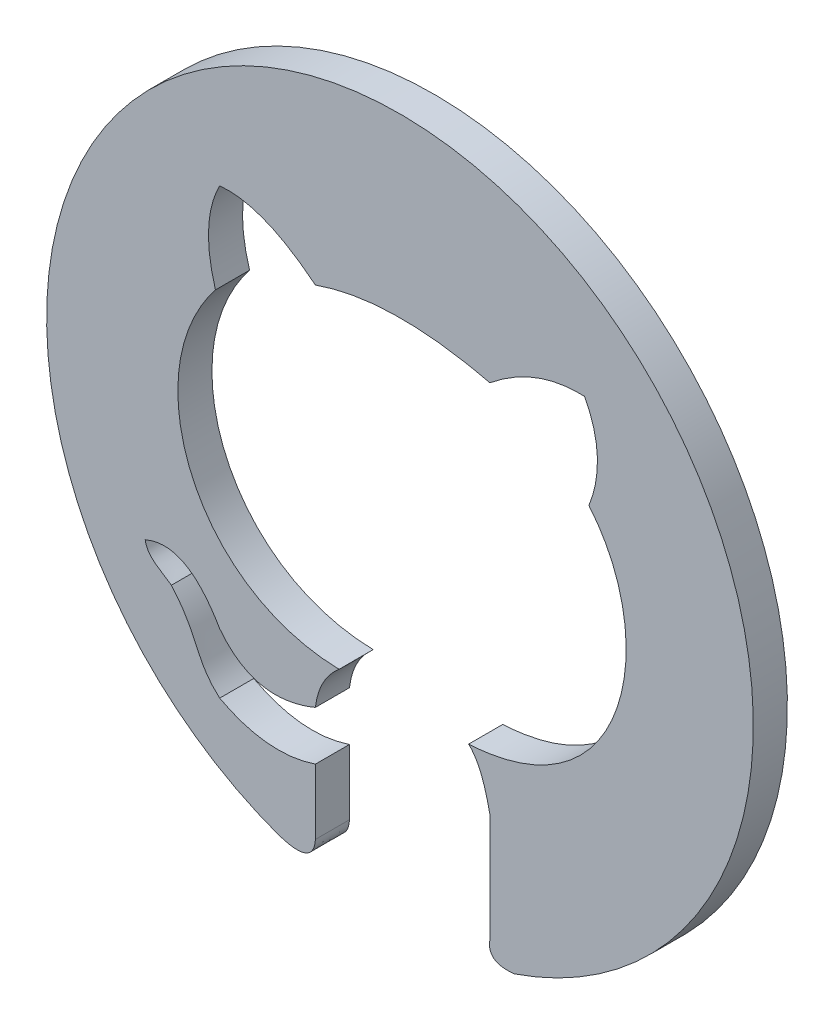
ISO-10303-21;
HEADER;
FILE_DESCRIPTION(('STEP AP214'),'2;1');
FILE_NAME('part.step','',(''),(''),'','','');
FILE_SCHEMA(('AUTOMOTIVE_DESIGN { 1 0 10303 214 1 1 1 1 }'));
ENDSEC;
DATA;
#1=APPLICATION_CONTEXT('core data for automotive mechanical design processes');
#2=APPLICATION_PROTOCOL_DEFINITION('international standard','automotive_design',2000,#1);
#3=PRODUCT_CONTEXT('',#1,'mechanical');
#4=PRODUCT('Part','Part','',(#3));
#5=PRODUCT_RELATED_PRODUCT_CATEGORY('part','',(#4));
#6=PRODUCT_DEFINITION_FORMATION('','',#4);
#7=PRODUCT_DEFINITION_CONTEXT('part definition',#1,'design');
#8=PRODUCT_DEFINITION('design','',#6,#7);
#9=PRODUCT_DEFINITION_SHAPE('','',#8);
#10=(LENGTH_UNIT() NAMED_UNIT(*) SI_UNIT(.MILLI.,.METRE.));
#11=(NAMED_UNIT(*) PLANE_ANGLE_UNIT() SI_UNIT($,.RADIAN.));
#12=(NAMED_UNIT(*) SI_UNIT($,.STERADIAN.) SOLID_ANGLE_UNIT());
#13=UNCERTAINTY_MEASURE_WITH_UNIT(LENGTH_MEASURE(1.E-05),#10,'distance_accuracy_value','');
#14=(GEOMETRIC_REPRESENTATION_CONTEXT(3) GLOBAL_UNCERTAINTY_ASSIGNED_CONTEXT((#13)) GLOBAL_UNIT_ASSIGNED_CONTEXT((#10,
#11,#12)) REPRESENTATION_CONTEXT('',''));
#15=CARTESIAN_POINT('',(0.,0.,0.));
#16=DIRECTION('',(0.,0.,1.));
#17=DIRECTION('',(1.,0.,0.));
#18=AXIS2_PLACEMENT_3D('',#15,#16,#17);
#19=CARTESIAN_POINT('',(-58.4126236276553,46.3352704257767,10.));
#20=CARTESIAN_POINT('',(-36.3647439419804,54.0986083432679,10.));
#21=CARTESIAN_POINT('',(-7.23264664261497,47.0806098964327,10.));
#22=B_SPLINE_CURVE_WITH_KNOTS('',2,(#19,#20,#21),.UNSPECIFIED.,.F.,.F.,(3,3),(0.,1.),.UNSPECIFIED.);
#23=DIRECTION('',(0.,0.,-1.));
#24=VECTOR('',#23,1.);
#25=SURFACE_OF_LINEAR_EXTRUSION('',#22,#24);
#26=CARTESIAN_POINT('',(-58.4126236276553,46.3352704257767,0.));
#27=CARTESIAN_POINT('',(-36.3647439419804,54.0986083432679,0.));
#28=CARTESIAN_POINT('',(-7.23264664261497,47.0806098964327,0.));
#29=B_SPLINE_CURVE_WITH_KNOTS('',2,(#26,#27,#28),.UNSPECIFIED.,.F.,.F.,(3,3),(0.,1.),.UNSPECIFIED.);
#30=CARTESIAN_POINT('',(-58.4126236276553,46.3352704257767,0.));
#31=VERTEX_POINT('',#30);
#32=CARTESIAN_POINT('',(-7.23264664261497,47.0806098964327,0.));
#33=VERTEX_POINT('',#32);
#34=EDGE_CURVE('E479',#31,#33,#29,.T.);
#35=ORIENTED_EDGE('',*,*,#34,.T.);
#36=DIRECTION('',(0.,0.,-1.));
#37=VECTOR('',#36,1.);
#38=CARTESIAN_POINT('',(-7.23264664261497,47.0806098964327,10.));
#39=LINE('',#38,#37);
#40=CARTESIAN_POINT('',(-7.23264664261497,47.0806098964327,10.));
#41=VERTEX_POINT('',#40);
#42=EDGE_CURVE('E11',#41,#33,#39,.T.);
#43=ORIENTED_EDGE('',*,*,#42,.F.);
#44=CARTESIAN_POINT('',(-58.4126236276553,46.3352704257767,10.));
#45=VERTEX_POINT('',#44);
#46=EDGE_CURVE('E377',#45,#41,#22,.T.);
#47=ORIENTED_EDGE('',*,*,#46,.F.);
#48=DIRECTION('',(0.,0.,-1.));
#49=VECTOR('',#48,1.);
#50=CARTESIAN_POINT('',(-58.4126236276553,46.3352704257767,10.));
#51=LINE('',#50,#49);
#52=EDGE_CURVE('E203',#45,#31,#51,.T.);
#53=ORIENTED_EDGE('',*,*,#52,.T.);
#54=EDGE_LOOP('',(#35,#43,#47,#53));
#55=FACE_BOUND('',#54,.T.);
#56=ADVANCED_FACE('F39',(#55),#25,.F.);
#57=CARTESIAN_POINT('',(-7.23264664261497,47.0806098964327,10.));
#58=CARTESIAN_POINT('',(6.30769316424814,58.1364784463819,10.));
#59=CARTESIAN_POINT('',(20.5933602618729,57.5153624856157,10.));
#60=B_SPLINE_CURVE_WITH_KNOTS('',2,(#57,#58,#59),.UNSPECIFIED.,.F.,.F.,(3,3),(0.,1.),.UNSPECIFIED.);
#61=DIRECTION('',(0.,0.,-1.));
#62=VECTOR('',#61,1.);
#63=SURFACE_OF_LINEAR_EXTRUSION('',#60,#62);
#64=CARTESIAN_POINT('',(-7.23264664261497,47.0806098964327,0.));
#65=CARTESIAN_POINT('',(6.30769316424814,58.1364784463819,0.));
#66=CARTESIAN_POINT('',(20.5933602618729,57.5153624856157,0.));
#67=B_SPLINE_CURVE_WITH_KNOTS('',2,(#64,#65,#66),.UNSPECIFIED.,.F.,.F.,(3,3),(0.,1.),.UNSPECIFIED.);
#68=CARTESIAN_POINT('',(20.5933602618729,57.5153624856157,0.));
#69=VERTEX_POINT('',#68);
#70=EDGE_CURVE('E470',#33,#69,#67,.T.);
#71=ORIENTED_EDGE('',*,*,#70,.T.);
#72=DIRECTION('',(0.,0.,-1.));
#73=VECTOR('',#72,1.);
#74=CARTESIAN_POINT('',(20.5933602618729,57.5153624856157,10.));
#75=LINE('',#74,#73);
#76=CARTESIAN_POINT('',(20.5933602618729,57.5153624856157,10.));
#77=VERTEX_POINT('',#76);
#78=EDGE_CURVE('E49',#77,#69,#75,.T.);
#79=ORIENTED_EDGE('',*,*,#78,.F.);
#80=EDGE_CURVE('E133',#41,#77,#60,.T.);
#81=ORIENTED_EDGE('',*,*,#80,.F.);
#82=ORIENTED_EDGE('',*,*,#42,.T.);
#83=EDGE_LOOP('',(#71,#79,#81,#82));
#84=FACE_BOUND('',#83,.T.);
#85=ADVANCED_FACE('F362',(#84),#63,.F.);
#86=CARTESIAN_POINT('',(20.5933602618729,57.5153624856157,10.));
#87=CARTESIAN_POINT('',(27.4214118004522,44.3992427704989,10.));
#88=CARTESIAN_POINT('',(21.8355927129661,30.4346950517837,10.));
#89=B_SPLINE_CURVE_WITH_KNOTS('',2,(#86,#87,#88),.UNSPECIFIED.,.F.,.F.,(3,3),(0.,1.),.UNSPECIFIED.);
#90=DIRECTION('',(0.,0.,-1.));
#91=VECTOR('',#90,1.);
#92=SURFACE_OF_LINEAR_EXTRUSION('',#89,#91);
#93=CARTESIAN_POINT('',(20.5933602618729,57.5153624856157,0.));
#94=CARTESIAN_POINT('',(27.4214118004522,44.3992427704989,0.));
#95=CARTESIAN_POINT('',(21.8355927129661,30.4346950517837,0.));
#96=B_SPLINE_CURVE_WITH_KNOTS('',2,(#93,#94,#95),.UNSPECIFIED.,.F.,.F.,(3,3),(0.,1.),.UNSPECIFIED.);
#97=CARTESIAN_POINT('',(21.8355927129661,30.4346950517837,0.));
#98=VERTEX_POINT('',#97);
#99=EDGE_CURVE('E465',#69,#98,#96,.T.);
#100=ORIENTED_EDGE('',*,*,#99,.T.);
#101=DIRECTION('',(0.,0.,-1.));
#102=VECTOR('',#101,1.);
#103=CARTESIAN_POINT('',(21.8355927129661,30.4346950517837,10.));
#104=LINE('',#103,#102);
#105=CARTESIAN_POINT('',(21.8355927129661,30.4346950517837,10.));
#106=VERTEX_POINT('',#105);
#107=EDGE_CURVE('E457',#106,#98,#104,.T.);
#108=ORIENTED_EDGE('',*,*,#107,.F.);
#109=EDGE_CURVE('E365',#77,#106,#89,.T.);
#110=ORIENTED_EDGE('',*,*,#109,.F.);
#111=ORIENTED_EDGE('',*,*,#78,.T.);
#112=EDGE_LOOP('',(#100,#108,#110,#111));
#113=FACE_BOUND('',#112,.T.);
#114=ADVANCED_FACE('F359',(#113),#92,.F.);
#115=CARTESIAN_POINT('',(21.8355927129661,30.4346950517837,10.));
#116=CARTESIAN_POINT('',(43.5742608162173,4.96939813083239,10.));
#117=CARTESIAN_POINT('',(33.4494442898155,-45.341538602167,10.));
#118=CARTESIAN_POINT('',(-13.4438088980812,-47.8259493670886,10.));
#119=B_SPLINE_CURVE_WITH_KNOTS('',3,(#115,#116,#117,#118),.UNSPECIFIED.,.F.,.F.,(4,4),(0.,1.),.UNSPECIFIED.);
#120=DIRECTION('',(0.,0.,-1.));
#121=VECTOR('',#120,1.);
#122=SURFACE_OF_LINEAR_EXTRUSION('',#119,#121);
#123=CARTESIAN_POINT('',(21.8355927129661,30.4346950517837,0.));
#124=CARTESIAN_POINT('',(43.5742608162173,4.96939813083239,0.));
#125=CARTESIAN_POINT('',(33.4494442898155,-45.341538602167,0.));
#126=CARTESIAN_POINT('',(-13.4438088980812,-47.8259493670886,0.));
#127=B_SPLINE_CURVE_WITH_KNOTS('',3,(#123,#124,#125,#126),.UNSPECIFIED.,.F.,.F.,(4,4),(0.,1.),.UNSPECIFIED.);
#128=CARTESIAN_POINT('',(-13.4438088980811,-47.8259493670886,0.));
#129=VERTEX_POINT('',#128);
#130=EDGE_CURVE('E472',#98,#129,#127,.T.);
#131=ORIENTED_EDGE('',*,*,#130,.T.);
#132=DIRECTION('',(0.,0.,-1.));
#133=VECTOR('',#132,1.);
#134=CARTESIAN_POINT('',(-13.4438088980811,-47.8259493670886,10.));
#135=LINE('',#134,#133);
#136=CARTESIAN_POINT('',(-13.4438088980811,-47.8259493670886,10.));
#137=VERTEX_POINT('',#136);
#138=EDGE_CURVE('E453',#137,#129,#135,.T.);
#139=ORIENTED_EDGE('',*,*,#138,.F.);
#140=EDGE_CURVE('E344',#106,#137,#119,.T.);
#141=ORIENTED_EDGE('',*,*,#140,.F.);
#142=ORIENTED_EDGE('',*,*,#107,.T.);
#143=EDGE_LOOP('',(#131,#139,#141,#142));
#144=FACE_BOUND('',#143,.T.);
#145=ADVANCED_FACE('F355',(#144),#122,.F.);
#146=CARTESIAN_POINT('',(-13.4438088980811,-47.8259493670886,10.));
#147=CARTESIAN_POINT('',(-10.1376652951444,-50.9254589948417,10.));
#148=CARTESIAN_POINT('',(-8.47481572581715,-56.5839891447782,10.));
#149=CARTESIAN_POINT('',(-7.23264664261497,-62.4842922899885,10.));
#150=B_SPLINE_CURVE_WITH_KNOTS('',3,(#146,#147,#148,#149),.UNSPECIFIED.,.F.,.F.,(4,4),(0.,1.),.UNSPECIFIED.);
#151=DIRECTION('',(0.,0.,-1.));
#152=VECTOR('',#151,1.);
#153=SURFACE_OF_LINEAR_EXTRUSION('',#150,#152);
#154=CARTESIAN_POINT('',(-13.4438088980811,-47.8259493670886,0.));
#155=CARTESIAN_POINT('',(-10.1376652951444,-50.9254589948417,0.));
#156=CARTESIAN_POINT('',(-8.47481572581715,-56.5839891447782,0.));
#157=CARTESIAN_POINT('',(-7.23264664261497,-62.4842922899885,0.));
#158=B_SPLINE_CURVE_WITH_KNOTS('',3,(#154,#155,#156,#157),.UNSPECIFIED.,.F.,.F.,(4,4),(0.,1.),.UNSPECIFIED.);
#159=CARTESIAN_POINT('',(-7.23264664261497,-62.4842922899885,0.));
#160=VERTEX_POINT('',#159);
#161=EDGE_CURVE('E477',#129,#160,#158,.T.);
#162=ORIENTED_EDGE('',*,*,#161,.T.);
#163=DIRECTION('',(0.,0.,-1.));
#164=VECTOR('',#163,1.);
#165=CARTESIAN_POINT('',(-7.23264664261497,-62.4842922899885,10.));
#166=LINE('',#165,#164);
#167=CARTESIAN_POINT('',(-7.23264664261497,-62.4842922899885,10.));
#168=VERTEX_POINT('',#167);
#169=EDGE_CURVE('E449',#168,#160,#166,.T.);
#170=ORIENTED_EDGE('',*,*,#169,.F.);
#171=EDGE_CURVE('E338',#137,#168,#150,.T.);
#172=ORIENTED_EDGE('',*,*,#171,.F.);
#173=ORIENTED_EDGE('',*,*,#138,.T.);
#174=EDGE_LOOP('',(#162,#170,#172,#173));
#175=FACE_BOUND('',#174,.T.);
#176=ADVANCED_FACE('F352',(#175),#153,.F.);
#177=CARTESIAN_POINT('',(-7.23264664261497,-62.4842922899885,10.));
#178=DIRECTION('',(1.,0.,0.));
#179=DIRECTION('',(0.,0.,-1.));
#180=AXIS2_PLACEMENT_3D('',#177,#178,#179);
#181=PLANE('',#180);
#182=DIRECTION('',(0.,-1.,0.));
#183=VECTOR('',#182,1.);
#184=CARTESIAN_POINT('',(-7.23264664261497,-62.4842922899885,0.));
#185=LINE('',#184,#183);
#186=CARTESIAN_POINT('',(-7.23264664261497,-94.5338895281933,0.));
#187=VERTEX_POINT('',#186);
#188=EDGE_CURVE('E498',#160,#187,#185,.T.);
#189=ORIENTED_EDGE('',*,*,#188,.T.);
#190=DIRECTION('',(0.,0.,-1.));
#191=VECTOR('',#190,1.);
#192=CARTESIAN_POINT('',(-7.23264664261497,-94.5338895281933,10.));
#193=LINE('',#192,#191);
#194=CARTESIAN_POINT('',(-7.23264664261497,-94.5338895281933,10.));
#195=VERTEX_POINT('',#194);
#196=EDGE_CURVE('E445',#195,#187,#193,.T.);
#197=ORIENTED_EDGE('',*,*,#196,.F.);
#198=DIRECTION('',(0.,-1.,0.));
#199=VECTOR('',#198,1.);
#200=CARTESIAN_POINT('',(-7.23264664261497,-62.4842922899885,10.));
#201=LINE('',#200,#199);
#202=EDGE_CURVE('E332',#168,#195,#201,.T.);
#203=ORIENTED_EDGE('',*,*,#202,.F.);
#204=ORIENTED_EDGE('',*,*,#169,.T.);
#205=EDGE_LOOP('',(#189,#197,#203,#204));
#206=FACE_BOUND('',#205,.T.);
#207=ADVANCED_FACE('F323',(#206),#181,.F.);
#208=CARTESIAN_POINT('',(-7.23264664261497,-94.5338895281933,10.));
#209=CARTESIAN_POINT('',(-8.15928520586117,-100.402600428753,10.));
#210=CARTESIAN_POINT('',(0.,-99.5028193325662,10.));
#211=B_SPLINE_CURVE_WITH_KNOTS('',2,(#208,#209,#210),.UNSPECIFIED.,.F.,.F.,(3,3),(0.,1.),.UNSPECIFIED.);
#212=DIRECTION('',(0.,0.,-1.));
#213=VECTOR('',#212,1.);
#214=SURFACE_OF_LINEAR_EXTRUSION('',#211,#213);
#215=CARTESIAN_POINT('',(-7.23264664261497,-94.5338895281933,0.));
#216=CARTESIAN_POINT('',(-8.15928520586117,-100.402600428753,0.));
#217=CARTESIAN_POINT('',(0.,-99.5028193325662,0.));
#218=B_SPLINE_CURVE_WITH_KNOTS('',2,(#215,#216,#217),.UNSPECIFIED.,.F.,.F.,(3,3),(0.,1.),.UNSPECIFIED.);
#219=CARTESIAN_POINT('',(0.,-99.5028193325662,0.));
#220=VERTEX_POINT('',#219);
#221=EDGE_CURVE('E504',#187,#220,#218,.T.);
#222=ORIENTED_EDGE('',*,*,#221,.T.);
#223=DIRECTION('',(0.,0.,-1.));
#224=VECTOR('',#223,1.);
#225=CARTESIAN_POINT('',(0.,-99.5028193325662,10.));
#226=LINE('',#225,#224);
#227=CARTESIAN_POINT('',(0.,-99.5028193325662,10.));
#228=VERTEX_POINT('',#227);
#229=EDGE_CURVE('E441',#228,#220,#226,.T.);
#230=ORIENTED_EDGE('',*,*,#229,.F.);
#231=EDGE_CURVE('E326',#195,#228,#211,.T.);
#232=ORIENTED_EDGE('',*,*,#231,.F.);
#233=ORIENTED_EDGE('',*,*,#196,.T.);
#234=EDGE_LOOP('',(#222,#230,#232,#233));
#235=FACE_BOUND('',#234,.T.);
#236=ADVANCED_FACE('F319',(#235),#214,.F.);
#237=CARTESIAN_POINT('',(-33.5898672709461,-1.42675649749703,10.));
#238=DIRECTION('',(0.,0.,-1.));
#239=DIRECTION('',(-1.,0.,0.));
#240=AXIS2_PLACEMENT_3D('',#237,#238,#239);
#241=CYLINDRICAL_SURFACE('',#240,103.668670699051);
#242=CARTESIAN_POINT('',(-33.5898672709461,-1.42675649749703,0.));
#243=DIRECTION('',(0.,0.,1.));
#244=DIRECTION('',(1.,0.,0.));
#245=AXIS2_PLACEMENT_3D('',#242,#243,#244);
#246=CIRCLE('',#245,103.668670699051);
#247=CARTESIAN_POINT('',(-69.0378620665223,-98.8466361395958,0.));
#248=VERTEX_POINT('',#247);
#249=EDGE_CURVE('E509',#220,#248,#246,.T.);
#250=ORIENTED_EDGE('',*,*,#249,.T.);
#251=DIRECTION('',(0.,0.,-1.));
#252=VECTOR('',#251,1.);
#253=CARTESIAN_POINT('',(-69.0378620665223,-98.8466361395958,10.));
#254=LINE('',#253,#252);
#255=CARTESIAN_POINT('',(-69.0378620665223,-98.8466361395958,10.));
#256=VERTEX_POINT('',#255);
#257=EDGE_CURVE('E437',#256,#248,#254,.T.);
#258=ORIENTED_EDGE('',*,*,#257,.F.);
#259=CARTESIAN_POINT('',(-33.5898672709461,-1.42675649749703,10.));
#260=DIRECTION('',(0.,0.,1.));
#261=DIRECTION('',(1.,0.,0.));
#262=AXIS2_PLACEMENT_3D('',#259,#260,#261);
#263=CIRCLE('',#262,103.668670699051);
#264=EDGE_CURVE('E305',#228,#256,#263,.T.);
#265=ORIENTED_EDGE('',*,*,#264,.F.);
#266=ORIENTED_EDGE('',*,*,#229,.T.);
#267=EDGE_LOOP('',(#250,#258,#265,#266));
#268=FACE_BOUND('',#267,.T.);
#269=ADVANCED_FACE('F315',(#268),#241,.T.);
#270=CARTESIAN_POINT('',(-69.0378620665223,-98.8466361395958,10.));
#271=CARTESIAN_POINT('',(-58.8779400653969,-102.146119368628,10.));
#272=CARTESIAN_POINT('',(-58.4126236276553,-94.5338895281933,10.));
#273=B_SPLINE_CURVE_WITH_KNOTS('',2,(#270,#271,#272),.UNSPECIFIED.,.F.,.F.,(3,3),(0.,1.),.UNSPECIFIED.);
#274=DIRECTION('',(0.,0.,-1.));
#275=VECTOR('',#274,1.);
#276=SURFACE_OF_LINEAR_EXTRUSION('',#273,#275);
#277=CARTESIAN_POINT('',(-69.0378620665223,-98.8466361395958,0.));
#278=CARTESIAN_POINT('',(-58.8779400653969,-102.146119368628,0.));
#279=CARTESIAN_POINT('',(-58.4126236276553,-94.5338895281933,0.));
#280=B_SPLINE_CURVE_WITH_KNOTS('',2,(#277,#278,#279),.UNSPECIFIED.,.F.,.F.,(3,3),(0.,1.),.UNSPECIFIED.);
#281=CARTESIAN_POINT('',(-58.4126236276553,-94.5338895281933,0.));
#282=VERTEX_POINT('',#281);
#283=EDGE_CURVE('E515',#248,#282,#280,.T.);
#284=ORIENTED_EDGE('',*,*,#283,.T.);
#285=DIRECTION('',(0.,0.,-1.));
#286=VECTOR('',#285,1.);
#287=CARTESIAN_POINT('',(-58.4126236276553,-94.5338895281933,10.));
#288=LINE('',#287,#286);
#289=CARTESIAN_POINT('',(-58.4126236276553,-94.5338895281933,10.));
#290=VERTEX_POINT('',#289);
#291=EDGE_CURVE('E433',#290,#282,#288,.T.);
#292=ORIENTED_EDGE('',*,*,#291,.F.);
#293=EDGE_CURVE('E299',#256,#290,#273,.T.);
#294=ORIENTED_EDGE('',*,*,#293,.F.);
#295=ORIENTED_EDGE('',*,*,#257,.T.);
#296=EDGE_LOOP('',(#284,#292,#294,#295));
#297=FACE_BOUND('',#296,.T.);
#298=ADVANCED_FACE('F311',(#297),#276,.F.);
#299=CARTESIAN_POINT('',(-58.4126236276553,-75.4035097813579,10.));
#300=DIRECTION('',(-1.,0.,0.));
#301=DIRECTION('',(0.,0.,1.));
#302=AXIS2_PLACEMENT_3D('',#299,#300,#301);
#303=PLANE('',#302);
#304=DIRECTION('',(0.,1.,0.));
#305=VECTOR('',#304,1.);
#306=CARTESIAN_POINT('',(-58.4126236276553,-75.4035097813579,0.));
#307=LINE('',#306,#305);
#308=CARTESIAN_POINT('',(-58.4126236276553,-75.4035097813579,0.));
#309=VERTEX_POINT('',#308);
#310=EDGE_CURVE('E520',#282,#309,#307,.T.);
#311=ORIENTED_EDGE('',*,*,#310,.T.);
#312=DIRECTION('',(0.,0.,-1.));
#313=VECTOR('',#312,1.);
#314=CARTESIAN_POINT('',(-58.4126236276553,-75.4035097813579,10.));
#315=LINE('',#314,#313);
#316=CARTESIAN_POINT('',(-58.4126236276553,-75.4035097813579,10.));
#317=VERTEX_POINT('',#316);
#318=EDGE_CURVE('E429',#317,#309,#315,.T.);
#319=ORIENTED_EDGE('',*,*,#318,.F.);
#320=DIRECTION('',(0.,1.,0.));
#321=VECTOR('',#320,1.);
#322=CARTESIAN_POINT('',(-58.4126236276553,-75.4035097813579,10.));
#323=LINE('',#322,#321);
#324=EDGE_CURVE('E293',#290,#317,#323,.T.);
#325=ORIENTED_EDGE('',*,*,#324,.F.);
#326=ORIENTED_EDGE('',*,*,#291,.T.);
#327=EDGE_LOOP('',(#311,#319,#325,#326));
#328=FACE_BOUND('',#327,.T.);
#329=ADVANCED_FACE('F314',(#328),#303,.F.);
#330=CARTESIAN_POINT('',(-58.4126236276553,-75.4035097813579,10.));
#331=CARTESIAN_POINT('',(-72.5140149813656,-80.1228981441508,10.));
#332=CARTESIAN_POINT('',(-86.4870770223618,-72.6705983889528,10.));
#333=B_SPLINE_CURVE_WITH_KNOTS('',2,(#330,#331,#332),.UNSPECIFIED.,.F.,.F.,(3,3),(0.,1.),.UNSPECIFIED.);
#334=DIRECTION('',(0.,0.,-1.));
#335=VECTOR('',#334,1.);
#336=SURFACE_OF_LINEAR_EXTRUSION('',#333,#335);
#337=CARTESIAN_POINT('',(-58.4126236276553,-75.4035097813579,0.));
#338=CARTESIAN_POINT('',(-72.5140149813656,-80.1228981441508,0.));
#339=CARTESIAN_POINT('',(-86.4870770223618,-72.6705983889528,0.));
#340=B_SPLINE_CURVE_WITH_KNOTS('',2,(#337,#338,#339),.UNSPECIFIED.,.F.,.F.,(3,3),(0.,1.),.UNSPECIFIED.);
#341=CARTESIAN_POINT('',(-86.4870770223618,-72.6705983889528,0.));
#342=VERTEX_POINT('',#341);
#343=EDGE_CURVE('E526',#309,#342,#340,.T.);
#344=ORIENTED_EDGE('',*,*,#343,.T.);
#345=DIRECTION('',(0.,0.,-1.));
#346=VECTOR('',#345,1.);
#347=CARTESIAN_POINT('',(-86.4870770223618,-72.6705983889528,10.));
#348=LINE('',#347,#346);
#349=CARTESIAN_POINT('',(-86.4870770223618,-72.6705983889528,10.));
#350=VERTEX_POINT('',#349);
#351=EDGE_CURVE('E425',#350,#342,#348,.T.);
#352=ORIENTED_EDGE('',*,*,#351,.F.);
#353=EDGE_CURVE('E284',#317,#350,#333,.T.);
#354=ORIENTED_EDGE('',*,*,#353,.F.);
#355=ORIENTED_EDGE('',*,*,#318,.T.);
#356=EDGE_LOOP('',(#344,#352,#354,#355));
#357=FACE_BOUND('',#356,.T.);
#358=ADVANCED_FACE('F275',(#357),#336,.F.);
#359=CARTESIAN_POINT('',(-86.4870770223618,-72.6705983889528,10.));
#360=CARTESIAN_POINT('',(-93.9384802403697,-66.1506205731959,10.));
#361=CARTESIAN_POINT('',(-92.2645681810868,-60.6817804916297,10.));
#362=CARTESIAN_POINT('',(-100.648526964824,-51.055753739931,10.));
#363=B_SPLINE_CURVE_WITH_KNOTS('',3,(#359,#360,#361,#362),.UNSPECIFIED.,.F.,.F.,(4,4),(0.,1.),.UNSPECIFIED.);
#364=DIRECTION('',(0.,0.,-1.));
#365=VECTOR('',#364,1.);
#366=SURFACE_OF_LINEAR_EXTRUSION('',#363,#365);
#367=CARTESIAN_POINT('',(-86.4870770223618,-72.6705983889528,0.));
#368=CARTESIAN_POINT('',(-93.9384802403697,-66.1506205731959,0.));
#369=CARTESIAN_POINT('',(-92.2645681810868,-60.6817804916297,0.));
#370=CARTESIAN_POINT('',(-100.648526964824,-51.055753739931,0.));
#371=B_SPLINE_CURVE_WITH_KNOTS('',3,(#367,#368,#369,#370),.UNSPECIFIED.,.F.,.F.,(4,4),(0.,1.),.UNSPECIFIED.);
#372=CARTESIAN_POINT('',(-100.648526964824,-51.055753739931,0.));
#373=VERTEX_POINT('',#372);
#374=EDGE_CURVE('E531',#342,#373,#371,.T.);
#375=ORIENTED_EDGE('',*,*,#374,.T.);
#376=DIRECTION('',(0.,0.,-1.));
#377=VECTOR('',#376,1.);
#378=CARTESIAN_POINT('',(-100.648526964824,-51.055753739931,10.));
#379=LINE('',#378,#377);
#380=CARTESIAN_POINT('',(-100.648526964824,-51.055753739931,10.));
#381=VERTEX_POINT('',#380);
#382=EDGE_CURVE('E421',#381,#373,#379,.T.);
#383=ORIENTED_EDGE('',*,*,#382,.F.);
#384=EDGE_CURVE('E279',#350,#381,#363,.T.);
#385=ORIENTED_EDGE('',*,*,#384,.F.);
#386=ORIENTED_EDGE('',*,*,#351,.T.);
#387=EDGE_LOOP('',(#375,#383,#385,#386));
#388=FACE_BOUND('',#387,.T.);
#389=ADVANCED_FACE('F271',(#388),#366,.F.);
#390=CARTESIAN_POINT('',(-100.648526964824,-51.055753739931,10.));
#391=CARTESIAN_POINT('',(-104.99114075986,-48.2640734431225,10.));
#392=CARTESIAN_POINT('',(-107.730240193874,-46.8679710269491,10.));
#393=CARTESIAN_POINT('',(-108.350368161602,-43.3539125431531,10.));
#394=B_SPLINE_CURVE_WITH_KNOTS('',3,(#390,#391,#392,#393),.UNSPECIFIED.,.F.,.F.,(4,4),(0.,1.),.UNSPECIFIED.);
#395=DIRECTION('',(0.,0.,-1.));
#396=VECTOR('',#395,1.);
#397=SURFACE_OF_LINEAR_EXTRUSION('',#394,#396);
#398=CARTESIAN_POINT('',(-100.648526964824,-51.055753739931,0.));
#399=CARTESIAN_POINT('',(-104.99114075986,-48.2640734431225,0.));
#400=CARTESIAN_POINT('',(-107.730240193874,-46.8679710269491,0.));
#401=CARTESIAN_POINT('',(-108.350368161602,-43.3539125431531,0.));
#402=B_SPLINE_CURVE_WITH_KNOTS('',3,(#398,#399,#400,#401),.UNSPECIFIED.,.F.,.F.,(4,4),(0.,1.),.UNSPECIFIED.);
#403=CARTESIAN_POINT('',(-108.350368161602,-43.3539125431531,0.));
#404=VERTEX_POINT('',#403);
#405=EDGE_CURVE('E539',#373,#404,#402,.T.);
#406=ORIENTED_EDGE('',*,*,#405,.T.);
#407=DIRECTION('',(0.,0.,-1.));
#408=VECTOR('',#407,1.);
#409=CARTESIAN_POINT('',(-108.350368161602,-43.3539125431531,10.));
#410=LINE('',#409,#408);
#411=CARTESIAN_POINT('',(-108.350368161602,-43.3539125431531,10.));
#412=VERTEX_POINT('',#411);
#413=EDGE_CURVE('E417',#412,#404,#410,.T.);
#414=ORIENTED_EDGE('',*,*,#413,.F.);
#415=EDGE_CURVE('E256',#381,#412,#394,.T.);
#416=ORIENTED_EDGE('',*,*,#415,.F.);
#417=ORIENTED_EDGE('',*,*,#382,.T.);
#418=EDGE_LOOP('',(#406,#414,#416,#417));
#419=FACE_BOUND('',#418,.T.);
#420=ADVANCED_FACE('F267',(#419),#397,.F.);
#421=CARTESIAN_POINT('',(-108.350368161602,-43.3539125431531,10.));
#422=CARTESIAN_POINT('',(-96.2391597300388,-38.0746678422151,10.));
#423=CARTESIAN_POINT('',(-86.4870770223618,-55.0308975834292,10.));
#424=B_SPLINE_CURVE_WITH_KNOTS('',2,(#421,#422,#423),.UNSPECIFIED.,.F.,.F.,(3,3),(0.,1.),.UNSPECIFIED.);
#425=DIRECTION('',(0.,0.,-1.));
#426=VECTOR('',#425,1.);
#427=SURFACE_OF_LINEAR_EXTRUSION('',#424,#426);
#428=CARTESIAN_POINT('',(-108.350368161602,-43.3539125431531,0.));
#429=CARTESIAN_POINT('',(-96.2391597300388,-38.0746678422151,0.));
#430=CARTESIAN_POINT('',(-86.4870770223618,-55.0308975834292,0.));
#431=B_SPLINE_CURVE_WITH_KNOTS('',2,(#428,#429,#430),.UNSPECIFIED.,.F.,.F.,(3,3),(0.,1.),.UNSPECIFIED.);
#432=CARTESIAN_POINT('',(-86.4870770223618,-55.0308975834292,0.));
#433=VERTEX_POINT('',#432);
#434=EDGE_CURVE('E547',#404,#433,#431,.T.);
#435=ORIENTED_EDGE('',*,*,#434,.T.);
#436=DIRECTION('',(0.,0.,-1.));
#437=VECTOR('',#436,1.);
#438=CARTESIAN_POINT('',(-86.4870770223618,-55.0308975834292,10.));
#439=LINE('',#438,#437);
#440=CARTESIAN_POINT('',(-86.4870770223618,-55.0308975834292,10.));
#441=VERTEX_POINT('',#440);
#442=EDGE_CURVE('E413',#441,#433,#439,.T.);
#443=ORIENTED_EDGE('',*,*,#442,.F.);
#444=EDGE_CURVE('E247',#412,#441,#424,.T.);
#445=ORIENTED_EDGE('',*,*,#444,.F.);
#446=ORIENTED_EDGE('',*,*,#413,.T.);
#447=EDGE_LOOP('',(#435,#443,#445,#446));
#448=FACE_BOUND('',#447,.T.);
#449=ADVANCED_FACE('F264',(#448),#427,.F.);
#450=CARTESIAN_POINT('',(-86.4870770223618,-55.0308975834292,10.));
#451=CARTESIAN_POINT('',(-76.2397818363888,-68.3834337348486,10.));
#452=CARTESIAN_POINT('',(-58.4126236276553,-60.9936133486767,10.));
#453=B_SPLINE_CURVE_WITH_KNOTS('',2,(#450,#451,#452),.UNSPECIFIED.,.F.,.F.,(3,3),(0.,1.),.UNSPECIFIED.);
#454=DIRECTION('',(0.,0.,-1.));
#455=VECTOR('',#454,1.);
#456=SURFACE_OF_LINEAR_EXTRUSION('',#453,#455);
#457=CARTESIAN_POINT('',(-86.4870770223618,-55.0308975834292,0.));
#458=CARTESIAN_POINT('',(-76.2397818363888,-68.3834337348486,0.));
#459=CARTESIAN_POINT('',(-58.4126236276553,-60.9936133486767,0.));
#460=B_SPLINE_CURVE_WITH_KNOTS('',2,(#457,#458,#459),.UNSPECIFIED.,.F.,.F.,(3,3),(0.,1.),.UNSPECIFIED.);
#461=CARTESIAN_POINT('',(-58.4126236276553,-60.9936133486767,0.));
#462=VERTEX_POINT('',#461);
#463=EDGE_CURVE('E555',#433,#462,#460,.T.);
#464=ORIENTED_EDGE('',*,*,#463,.T.);
#465=DIRECTION('',(0.,0.,-1.));
#466=VECTOR('',#465,1.);
#467=CARTESIAN_POINT('',(-58.4126236276553,-60.9936133486767,10.));
#468=LINE('',#467,#466);
#469=CARTESIAN_POINT('',(-58.4126236276553,-60.9936133486767,10.));
#470=VERTEX_POINT('',#469);
#471=EDGE_CURVE('E409',#470,#462,#468,.T.);
#472=ORIENTED_EDGE('',*,*,#471,.F.);
#473=EDGE_CURVE('E238',#441,#470,#453,.T.);
#474=ORIENTED_EDGE('',*,*,#473,.F.);
#475=ORIENTED_EDGE('',*,*,#442,.T.);
#476=EDGE_LOOP('',(#464,#472,#474,#475));
#477=FACE_BOUND('',#476,.T.);
#478=ADVANCED_FACE('F230',(#477),#456,.F.);
#479=CARTESIAN_POINT('',(-58.4126236276553,-60.9936133486767,10.));
#480=CARTESIAN_POINT('',(-57.4818419566607,-52.9268388667233,10.));
#481=CARTESIAN_POINT('',(-51.4561219015333,-47.8259493670886,10.));
#482=B_SPLINE_CURVE_WITH_KNOTS('',2,(#479,#480,#481),.UNSPECIFIED.,.F.,.F.,(3,3),(0.,1.),.UNSPECIFIED.);
#483=DIRECTION('',(0.,0.,-1.));
#484=VECTOR('',#483,1.);
#485=SURFACE_OF_LINEAR_EXTRUSION('',#482,#484);
#486=CARTESIAN_POINT('',(-58.4126236276553,-60.9936133486767,0.));
#487=CARTESIAN_POINT('',(-57.4818419566607,-52.9268388667233,0.));
#488=CARTESIAN_POINT('',(-51.4561219015333,-47.8259493670886,0.));
#489=B_SPLINE_CURVE_WITH_KNOTS('',2,(#486,#487,#488),.UNSPECIFIED.,.F.,.F.,(3,3),(0.,1.),.UNSPECIFIED.);
#490=CARTESIAN_POINT('',(-51.4561219015332,-47.8259493670886,0.));
#491=VERTEX_POINT('',#490);
#492=EDGE_CURVE('E563',#462,#491,#489,.T.);
#493=ORIENTED_EDGE('',*,*,#492,.T.);
#494=DIRECTION('',(0.,0.,-1.));
#495=VECTOR('',#494,1.);
#496=CARTESIAN_POINT('',(-51.4561219015332,-47.8259493670886,10.));
#497=LINE('',#496,#495);
#498=CARTESIAN_POINT('',(-51.4561219015332,-47.8259493670886,10.));
#499=VERTEX_POINT('',#498);
#500=EDGE_CURVE('E196',#499,#491,#497,.T.);
#501=ORIENTED_EDGE('',*,*,#500,.F.);
#502=EDGE_CURVE('E185',#470,#499,#482,.T.);
#503=ORIENTED_EDGE('',*,*,#502,.F.);
#504=ORIENTED_EDGE('',*,*,#471,.T.);
#505=EDGE_LOOP('',(#493,#501,#503,#504));
#506=FACE_BOUND('',#505,.T.);
#507=ADVANCED_FACE('F227',(#506),#485,.F.);
#508=CARTESIAN_POINT('',(-51.4561219015332,-47.8259493670886,10.));
#509=CARTESIAN_POINT('',(-93.9982200316377,-46.8943705759185,10.));
#510=CARTESIAN_POINT('',(-112.261906540531,-0.619225286286869,10.));
#511=CARTESIAN_POINT('',(-87.729309473455,30.4346950517837,10.));
#512=B_SPLINE_CURVE_WITH_KNOTS('',3,(#508,#509,#510,#511),.UNSPECIFIED.,.F.,.F.,(4,4),(0.,1.),.UNSPECIFIED.);
#513=DIRECTION('',(0.,0.,-1.));
#514=VECTOR('',#513,1.);
#515=SURFACE_OF_LINEAR_EXTRUSION('',#512,#514);
#516=CARTESIAN_POINT('',(-51.4561219015332,-47.8259493670886,0.));
#517=CARTESIAN_POINT('',(-93.9982200316377,-46.8943705759185,0.));
#518=CARTESIAN_POINT('',(-112.261906540531,-0.619225286286869,0.));
#519=CARTESIAN_POINT('',(-87.729309473455,30.4346950517837,0.));
#520=B_SPLINE_CURVE_WITH_KNOTS('',3,(#516,#517,#518,#519),.UNSPECIFIED.,.F.,.F.,(4,4),(0.,1.),.UNSPECIFIED.);
#521=CARTESIAN_POINT('',(-87.729309473455,30.4346950517837,0.));
#522=VERTEX_POINT('',#521);
#523=EDGE_CURVE('E194',#491,#522,#520,.T.);
#524=ORIENTED_EDGE('',*,*,#523,.T.);
#525=DIRECTION('',(0.,0.,-1.));
#526=VECTOR('',#525,1.);
#527=CARTESIAN_POINT('',(-87.729309473455,30.4346950517837,10.));
#528=LINE('',#527,#526);
#529=CARTESIAN_POINT('',(-87.729309473455,30.4346950517837,10.));
#530=VERTEX_POINT('',#529);
#531=EDGE_CURVE('E191',#530,#522,#528,.T.);
#532=ORIENTED_EDGE('',*,*,#531,.F.);
#533=EDGE_CURVE('E179',#499,#530,#512,.T.);
#534=ORIENTED_EDGE('',*,*,#533,.F.);
#535=ORIENTED_EDGE('',*,*,#500,.T.);
#536=EDGE_LOOP('',(#524,#532,#534,#535));
#537=FACE_BOUND('',#536,.T.);
#538=ADVANCED_FACE('F192',(#537),#515,.F.);
#539=CARTESIAN_POINT('',(-87.729309473455,30.4346950517837,10.));
#540=CARTESIAN_POINT('',(-92.3845269835615,46.0308546664373,10.));
#541=CARTESIAN_POINT('',(-86.4870770223618,57.5153624856157,10.));
#542=B_SPLINE_CURVE_WITH_KNOTS('',2,(#539,#540,#541),.UNSPECIFIED.,.F.,.F.,(3,3),(0.,1.),.UNSPECIFIED.);
#543=DIRECTION('',(0.,0.,-1.));
#544=VECTOR('',#543,1.);
#545=SURFACE_OF_LINEAR_EXTRUSION('',#542,#544);
#546=CARTESIAN_POINT('',(-87.729309473455,30.4346950517837,0.));
#547=CARTESIAN_POINT('',(-92.3845269835615,46.0308546664373,0.));
#548=CARTESIAN_POINT('',(-86.4870770223618,57.5153624856157,0.));
#549=B_SPLINE_CURVE_WITH_KNOTS('',2,(#546,#547,#548),.UNSPECIFIED.,.F.,.F.,(3,3),(0.,1.),.UNSPECIFIED.);
#550=CARTESIAN_POINT('',(-86.4870770223618,57.5153624856157,0.));
#551=VERTEX_POINT('',#550);
#552=EDGE_CURVE('E119',#522,#551,#549,.T.);
#553=ORIENTED_EDGE('',*,*,#552,.T.);
#554=DIRECTION('',(0.,0.,-1.));
#555=VECTOR('',#554,1.);
#556=CARTESIAN_POINT('',(-86.4870770223618,57.5153624856157,10.));
#557=LINE('',#556,#555);
#558=CARTESIAN_POINT('',(-86.4870770223618,57.5153624856157,10.));
#559=VERTEX_POINT('',#558);
#560=EDGE_CURVE('E197',#559,#551,#557,.T.);
#561=ORIENTED_EDGE('',*,*,#560,.F.);
#562=EDGE_CURVE('E183',#530,#559,#542,.T.);
#563=ORIENTED_EDGE('',*,*,#562,.F.);
#564=ORIENTED_EDGE('',*,*,#531,.T.);
#565=EDGE_LOOP('',(#553,#561,#563,#564));
#566=FACE_BOUND('',#565,.T.);
#567=ADVANCED_FACE('F199',(#566),#545,.F.);
#568=CARTESIAN_POINT('',(-86.4870770223618,57.5153624856157,10.));
#569=CARTESIAN_POINT('',(-73.7579265526884,58.7572308241204,10.));
#570=CARTESIAN_POINT('',(-58.4126236276553,46.3352704257767,10.));
#571=B_SPLINE_CURVE_WITH_KNOTS('',2,(#568,#569,#570),.UNSPECIFIED.,.F.,.F.,(3,3),(0.,1.),.UNSPECIFIED.);
#572=DIRECTION('',(0.,0.,-1.));
#573=VECTOR('',#572,1.);
#574=SURFACE_OF_LINEAR_EXTRUSION('',#571,#573);
#575=CARTESIAN_POINT('',(-86.4870770223618,57.5153624856157,0.));
#576=CARTESIAN_POINT('',(-73.7579265526884,58.7572308241204,0.));
#577=CARTESIAN_POINT('',(-58.4126236276553,46.3352704257767,0.));
#578=B_SPLINE_CURVE_WITH_KNOTS('',2,(#575,#576,#577),.UNSPECIFIED.,.F.,.F.,(3,3),(0.,1.),.UNSPECIFIED.);
#579=EDGE_CURVE('E125',#551,#31,#578,.T.);
#580=ORIENTED_EDGE('',*,*,#579,.T.);
#581=ORIENTED_EDGE('',*,*,#52,.F.);
#582=EDGE_CURVE('E57',#559,#45,#571,.T.);
#583=ORIENTED_EDGE('',*,*,#582,.F.);
#584=ORIENTED_EDGE('',*,*,#560,.T.);
#585=EDGE_LOOP('',(#580,#581,#583,#584));
#586=FACE_BOUND('',#585,.T.);
#587=ADVANCED_FACE('F223',(#586),#574,.F.);
#588=CARTESIAN_POINT('',(-34.5936895385577,50.4032742521863,10.));
#589=DIRECTION('',(0.,0.,1.));
#590=DIRECTION('',(1.,0.,0.));
#591=AXIS2_PLACEMENT_3D('',#588,#589,#590);
#592=PLANE('',#591);
#593=ORIENTED_EDGE('',*,*,#46,.T.);
#594=ORIENTED_EDGE('',*,*,#80,.T.);
#595=ORIENTED_EDGE('',*,*,#109,.T.);
#596=ORIENTED_EDGE('',*,*,#140,.T.);
#597=ORIENTED_EDGE('',*,*,#171,.T.);
#598=ORIENTED_EDGE('',*,*,#202,.T.);
#599=ORIENTED_EDGE('',*,*,#231,.T.);
#600=ORIENTED_EDGE('',*,*,#264,.T.);
#601=ORIENTED_EDGE('',*,*,#293,.T.);
#602=ORIENTED_EDGE('',*,*,#324,.T.);
#603=ORIENTED_EDGE('',*,*,#353,.T.);
#604=ORIENTED_EDGE('',*,*,#384,.T.);
#605=ORIENTED_EDGE('',*,*,#415,.T.);
#606=ORIENTED_EDGE('',*,*,#444,.T.);
#607=ORIENTED_EDGE('',*,*,#473,.T.);
#608=ORIENTED_EDGE('',*,*,#502,.T.);
#609=ORIENTED_EDGE('',*,*,#533,.T.);
#610=ORIENTED_EDGE('',*,*,#562,.T.);
#611=ORIENTED_EDGE('',*,*,#582,.T.);
#612=EDGE_LOOP('',(#593,#594,#595,#596,#597,#598,#599,#600,#601,#602,#603,#604,#605,#606,#607,
#608,#609,#610,#611));
#613=FACE_BOUND('',#612,.T.);
#614=ADVANCED_FACE('F181',(#613),#592,.T.);
#615=CARTESIAN_POINT('',(-34.5936895385577,50.4032742521863,0.));
#616=DIRECTION('',(0.,0.,1.));
#617=DIRECTION('',(1.,0.,0.));
#618=AXIS2_PLACEMENT_3D('',#615,#616,#617);
#619=PLANE('',#618);
#620=ORIENTED_EDGE('',*,*,#34,.F.);
#621=ORIENTED_EDGE('',*,*,#579,.F.);
#622=ORIENTED_EDGE('',*,*,#552,.F.);
#623=ORIENTED_EDGE('',*,*,#523,.F.);
#624=ORIENTED_EDGE('',*,*,#492,.F.);
#625=ORIENTED_EDGE('',*,*,#463,.F.);
#626=ORIENTED_EDGE('',*,*,#434,.F.);
#627=ORIENTED_EDGE('',*,*,#405,.F.);
#628=ORIENTED_EDGE('',*,*,#374,.F.);
#629=ORIENTED_EDGE('',*,*,#343,.F.);
#630=ORIENTED_EDGE('',*,*,#310,.F.);
#631=ORIENTED_EDGE('',*,*,#283,.F.);
#632=ORIENTED_EDGE('',*,*,#249,.F.);
#633=ORIENTED_EDGE('',*,*,#221,.F.);
#634=ORIENTED_EDGE('',*,*,#188,.F.);
#635=ORIENTED_EDGE('',*,*,#161,.F.);
#636=ORIENTED_EDGE('',*,*,#130,.F.);
#637=ORIENTED_EDGE('',*,*,#99,.F.);
#638=ORIENTED_EDGE('',*,*,#70,.F.);
#639=EDGE_LOOP('',(#620,#621,#622,#623,#624,#625,#626,#627,#628,#629,#630,#631,#632,#633,#634,
#635,#636,#637,#638));
#640=FACE_BOUND('',#639,.T.);
#641=ADVANCED_FACE('F469',(#640),#619,.F.);
#642=CLOSED_SHELL('',(#56,#85,#114,#145,#176,#207,#236,#269,#298,#329,#358,#389,#420,#449,#478,
#507,#538,#567,#587,#614,#641));
#643=MANIFOLD_SOLID_BREP('B2',#642);
#644=ADVANCED_BREP_SHAPE_REPRESENTATION('',(#18,#643),#14);
#645=SHAPE_DEFINITION_REPRESENTATION(#9,#644);
ENDSEC;
END-ISO-10303-21;
